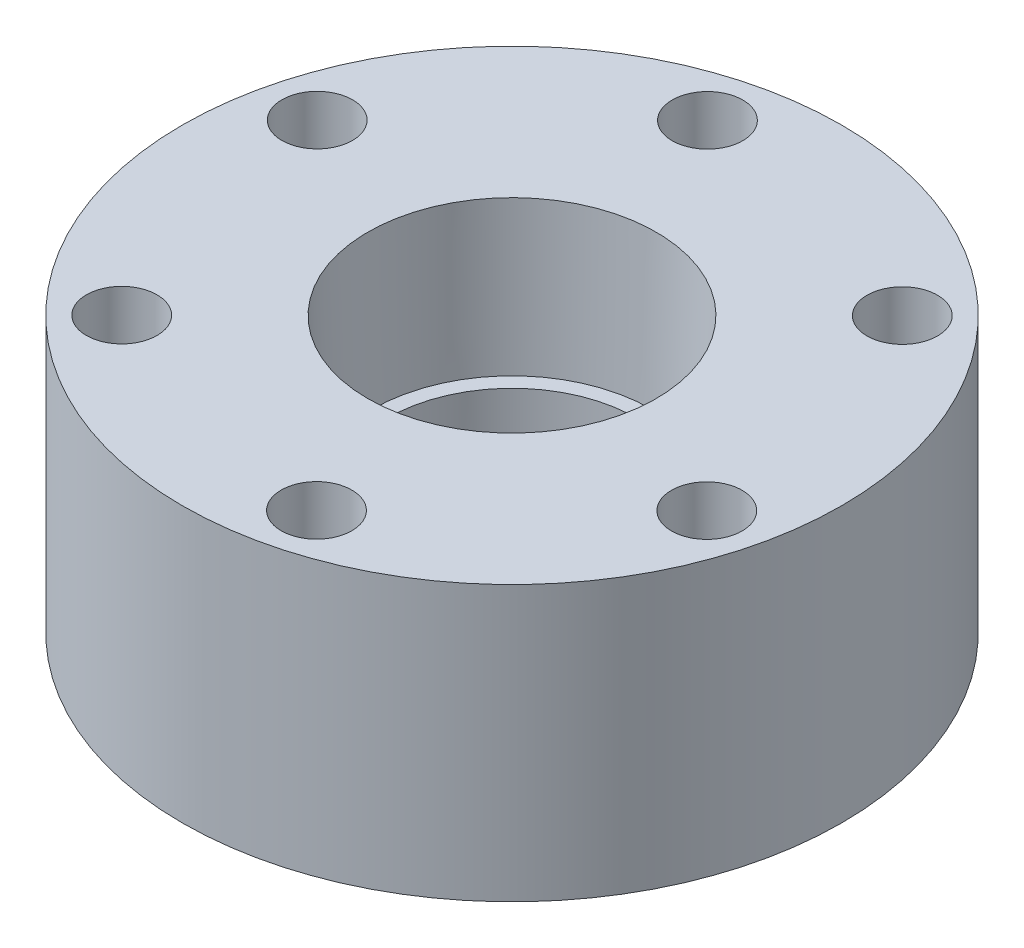
ISO-10303-21;
HEADER;
FILE_DESCRIPTION(('STEP AP214'),'2;1');
FILE_NAME('part.step','',(''),(''),'','','');
FILE_SCHEMA(('AUTOMOTIVE_DESIGN { 1 0 10303 214 1 1 1 1 }'));
ENDSEC;
DATA;
#1=APPLICATION_CONTEXT('core data for automotive mechanical design processes');
#2=APPLICATION_PROTOCOL_DEFINITION('international standard','automotive_design',2000,#1);
#3=PRODUCT_CONTEXT('',#1,'mechanical');
#4=PRODUCT('Part','Part','',(#3));
#5=PRODUCT_RELATED_PRODUCT_CATEGORY('part','',(#4));
#6=PRODUCT_DEFINITION_FORMATION('','',#4);
#7=PRODUCT_DEFINITION_CONTEXT('part definition',#1,'design');
#8=PRODUCT_DEFINITION('design','',#6,#7);
#9=PRODUCT_DEFINITION_SHAPE('','',#8);
#10=(LENGTH_UNIT() NAMED_UNIT(*) SI_UNIT(.MILLI.,.METRE.));
#11=(NAMED_UNIT(*) PLANE_ANGLE_UNIT() SI_UNIT($,.RADIAN.));
#12=(NAMED_UNIT(*) SI_UNIT($,.STERADIAN.) SOLID_ANGLE_UNIT());
#13=UNCERTAINTY_MEASURE_WITH_UNIT(LENGTH_MEASURE(1.E-05),#10,'distance_accuracy_value','');
#14=(GEOMETRIC_REPRESENTATION_CONTEXT(3) GLOBAL_UNCERTAINTY_ASSIGNED_CONTEXT((#13)) GLOBAL_UNIT_ASSIGNED_CONTEXT((#10,
#11,#12)) REPRESENTATION_CONTEXT('',''));
#15=CARTESIAN_POINT('',(0.,0.,0.));
#16=DIRECTION('',(0.,0.,1.));
#17=DIRECTION('',(1.,0.,0.));
#18=AXIS2_PLACEMENT_3D('',#15,#16,#17);
#19=CARTESIAN_POINT('',(0.,25.4,0.));
#20=DIRECTION('',(0.,-1.,0.));
#21=DIRECTION('',(0.,0.,-1.));
#22=AXIS2_PLACEMENT_3D('',#19,#20,#21);
#23=CYLINDRICAL_SURFACE('',#22,30.48);
#24=CARTESIAN_POINT('',(0.,25.4,0.));
#25=DIRECTION('',(0.,1.,0.));
#26=DIRECTION('',(0.,0.,1.));
#27=AXIS2_PLACEMENT_3D('',#24,#25,#26);
#28=CIRCLE('',#27,30.48);
#29=CARTESIAN_POINT('',(0.,25.4,30.48));
#30=VERTEX_POINT('',#29);
#31=EDGE_CURVE('E10',#30,#30,#28,.T.);
#32=ORIENTED_EDGE('',*,*,#31,.F.);
#33=EDGE_LOOP('',(#32));
#34=FACE_BOUND('',#33,.T.);
#35=CARTESIAN_POINT('',(0.,0.,0.));
#36=DIRECTION('',(0.,1.,0.));
#37=DIRECTION('',(0.,0.,1.));
#38=AXIS2_PLACEMENT_3D('',#35,#36,#37);
#39=CIRCLE('',#38,30.48);
#40=CARTESIAN_POINT('',(0.,0.,30.48));
#41=VERTEX_POINT('',#40);
#42=EDGE_CURVE('E38',#41,#41,#39,.T.);
#43=ORIENTED_EDGE('',*,*,#42,.T.);
#44=EDGE_LOOP('',(#43));
#45=FACE_BOUND('',#44,.T.);
#46=ADVANCED_FACE('F31',(#34,#45),#23,.T.);
#47=CARTESIAN_POINT('',(0.,25.4,0.));
#48=DIRECTION('',(0.,1.,0.));
#49=DIRECTION('',(0.,0.,1.));
#50=AXIS2_PLACEMENT_3D('',#47,#48,#49);
#51=PLANE('',#50);
#52=CARTESIAN_POINT('',(-24.6365333313498,25.4,-6.62788666644747));
#53=DIRECTION('',(0.,1.,0.));
#54=DIRECTION('',(0.,0.,1.));
#55=AXIS2_PLACEMENT_3D('',#52,#53,#54);
#56=CIRCLE('',#55,3.26389999999999);
#57=CARTESIAN_POINT('',(-24.6365333313498,25.4,-3.36398666644748));
#58=VERTEX_POINT('',#57);
#59=EDGE_CURVE('E92',#58,#58,#56,.T.);
#60=ORIENTED_EDGE('',*,*,#59,.F.);
#61=EDGE_LOOP('',(#60));
#62=FACE_BOUND('',#61,.T.);
#63=CARTESIAN_POINT('',(-18.0581848922215,25.4,18.0219203929074));
#64=DIRECTION('',(0.,1.,0.));
#65=DIRECTION('',(0.,0.,1.));
#66=AXIS2_PLACEMENT_3D('',#63,#64,#65);
#67=CIRCLE('',#66,3.26389999999999);
#68=CARTESIAN_POINT('',(-18.0581848922215,25.4,21.2858203929074));
#69=VERTEX_POINT('',#68);
#70=EDGE_CURVE('E86',#69,#69,#67,.T.);
#71=ORIENTED_EDGE('',*,*,#70,.F.);
#72=EDGE_LOOP('',(#71));
#73=FACE_BOUND('',#72,.T.);
#74=CARTESIAN_POINT('',(6.5783484391286,25.4,24.649807059354));
#75=DIRECTION('',(0.,1.,0.));
#76=DIRECTION('',(0.,0.,1.));
#77=AXIS2_PLACEMENT_3D('',#74,#75,#76);
#78=CIRCLE('',#77,3.26389999999999);
#79=CARTESIAN_POINT('',(6.5783484391286,25.4,27.913707059354));
#80=VERTEX_POINT('',#79);
#81=EDGE_CURVE('E80',#80,#80,#78,.T.);
#82=ORIENTED_EDGE('',*,*,#81,.F.);
#83=EDGE_LOOP('',(#82));
#84=FACE_BOUND('',#83,.T.);
#85=CARTESIAN_POINT('',(24.6365333313509,25.4,6.62788666644592));
#86=DIRECTION('',(0.,1.,0.));
#87=DIRECTION('',(0.,0.,1.));
#88=AXIS2_PLACEMENT_3D('',#85,#86,#87);
#89=CIRCLE('',#88,3.26389999999999);
#90=CARTESIAN_POINT('',(24.6365333313509,25.4,9.89178666644591));
#91=VERTEX_POINT('',#90);
#92=EDGE_CURVE('E74',#91,#91,#89,.T.);
#93=ORIENTED_EDGE('',*,*,#92,.F.);
#94=EDGE_LOOP('',(#93));
#95=FACE_BOUND('',#94,.T.);
#96=CARTESIAN_POINT('',(18.0581848922226,25.4,-18.0219203929091));
#97=DIRECTION('',(0.,1.,0.));
#98=DIRECTION('',(0.,0.,1.));
#99=AXIS2_PLACEMENT_3D('',#96,#97,#98);
#100=CIRCLE('',#99,3.26389999999999);
#101=CARTESIAN_POINT('',(18.0581848922226,25.4,-14.7580203929091));
#102=VERTEX_POINT('',#101);
#103=EDGE_CURVE('E68',#102,#102,#100,.T.);
#104=ORIENTED_EDGE('',*,*,#103,.F.);
#105=EDGE_LOOP('',(#104));
#106=FACE_BOUND('',#105,.T.);
#107=CARTESIAN_POINT('',(-6.57834843912766,25.4,-24.6498070593557));
#108=DIRECTION('',(0.,1.,0.));
#109=DIRECTION('',(0.,0.,1.));
#110=AXIS2_PLACEMENT_3D('',#107,#108,#109);
#111=CIRCLE('',#110,3.26389999999999);
#112=CARTESIAN_POINT('',(-6.57834843912766,25.4,-21.3859070593557));
#113=VERTEX_POINT('',#112);
#114=EDGE_CURVE('E62',#113,#113,#111,.T.);
#115=ORIENTED_EDGE('',*,*,#114,.F.);
#116=EDGE_LOOP('',(#115));
#117=FACE_BOUND('',#116,.T.);
#118=CARTESIAN_POINT('',(0.,25.4,0.));
#119=DIRECTION('',(0.,1.,0.));
#120=DIRECTION('',(0.,0.,1.));
#121=AXIS2_PLACEMENT_3D('',#118,#119,#120);
#122=CIRCLE('',#121,13.3324854);
#123=CARTESIAN_POINT('',(0.,25.4,13.3324854));
#124=VERTEX_POINT('',#123);
#125=EDGE_CURVE('E56',#124,#124,#122,.T.);
#126=ORIENTED_EDGE('',*,*,#125,.F.);
#127=EDGE_LOOP('',(#126));
#128=FACE_BOUND('',#127,.T.);
#129=ORIENTED_EDGE('',*,*,#31,.T.);
#130=EDGE_LOOP('',(#129));
#131=FACE_BOUND('',#130,.T.);
#132=ADVANCED_FACE('F98',(#62,#73,#84,#95,#106,#117,#128,#131),#51,.T.);
#133=CARTESIAN_POINT('',(0.,0.,0.));
#134=DIRECTION('',(0.,1.,0.));
#135=DIRECTION('',(0.,0.,1.));
#136=AXIS2_PLACEMENT_3D('',#133,#134,#135);
#137=PLANE('',#136);
#138=CARTESIAN_POINT('',(-24.6365333313498,0.,-6.62788666644747));
#139=DIRECTION('',(0.,1.,0.));
#140=DIRECTION('',(0.,0.,1.));
#141=AXIS2_PLACEMENT_3D('',#138,#139,#140);
#142=CIRCLE('',#141,3.2639);
#143=CARTESIAN_POINT('',(-24.6365333313498,0.,-3.36398666644747));
#144=VERTEX_POINT('',#143);
#145=EDGE_CURVE('E89',#144,#144,#142,.T.);
#146=ORIENTED_EDGE('',*,*,#145,.T.);
#147=EDGE_LOOP('',(#146));
#148=FACE_BOUND('',#147,.T.);
#149=CARTESIAN_POINT('',(-18.0581848922215,0.,18.0219203929074));
#150=DIRECTION('',(0.,1.,0.));
#151=DIRECTION('',(0.,0.,1.));
#152=AXIS2_PLACEMENT_3D('',#149,#150,#151);
#153=CIRCLE('',#152,3.2639);
#154=CARTESIAN_POINT('',(-18.0581848922215,0.,21.2858203929074));
#155=VERTEX_POINT('',#154);
#156=EDGE_CURVE('E83',#155,#155,#153,.T.);
#157=ORIENTED_EDGE('',*,*,#156,.T.);
#158=EDGE_LOOP('',(#157));
#159=FACE_BOUND('',#158,.T.);
#160=CARTESIAN_POINT('',(6.5783484391286,0.,24.649807059354));
#161=DIRECTION('',(0.,1.,0.));
#162=DIRECTION('',(0.,0.,1.));
#163=AXIS2_PLACEMENT_3D('',#160,#161,#162);
#164=CIRCLE('',#163,3.2639);
#165=CARTESIAN_POINT('',(6.5783484391286,0.,27.913707059354));
#166=VERTEX_POINT('',#165);
#167=EDGE_CURVE('E77',#166,#166,#164,.T.);
#168=ORIENTED_EDGE('',*,*,#167,.T.);
#169=EDGE_LOOP('',(#168));
#170=FACE_BOUND('',#169,.T.);
#171=CARTESIAN_POINT('',(24.6365333313509,0.,6.62788666644592));
#172=DIRECTION('',(0.,1.,0.));
#173=DIRECTION('',(0.,0.,1.));
#174=AXIS2_PLACEMENT_3D('',#171,#172,#173);
#175=CIRCLE('',#174,3.2639);
#176=CARTESIAN_POINT('',(24.6365333313509,0.,9.89178666644592));
#177=VERTEX_POINT('',#176);
#178=EDGE_CURVE('E71',#177,#177,#175,.T.);
#179=ORIENTED_EDGE('',*,*,#178,.T.);
#180=EDGE_LOOP('',(#179));
#181=FACE_BOUND('',#180,.T.);
#182=CARTESIAN_POINT('',(18.0581848922226,0.,-18.0219203929091));
#183=DIRECTION('',(0.,1.,0.));
#184=DIRECTION('',(0.,0.,1.));
#185=AXIS2_PLACEMENT_3D('',#182,#183,#184);
#186=CIRCLE('',#185,3.2639);
#187=CARTESIAN_POINT('',(18.0581848922226,0.,-14.7580203929091));
#188=VERTEX_POINT('',#187);
#189=EDGE_CURVE('E65',#188,#188,#186,.T.);
#190=ORIENTED_EDGE('',*,*,#189,.T.);
#191=EDGE_LOOP('',(#190));
#192=FACE_BOUND('',#191,.T.);
#193=CARTESIAN_POINT('',(-6.57834843912766,0.,-24.6498070593557));
#194=DIRECTION('',(0.,1.,0.));
#195=DIRECTION('',(0.,0.,1.));
#196=AXIS2_PLACEMENT_3D('',#193,#194,#195);
#197=CIRCLE('',#196,3.2639);
#198=CARTESIAN_POINT('',(-6.57834843912766,0.,-21.3859070593557));
#199=VERTEX_POINT('',#198);
#200=EDGE_CURVE('E59',#199,#199,#197,.T.);
#201=ORIENTED_EDGE('',*,*,#200,.T.);
#202=EDGE_LOOP('',(#201));
#203=FACE_BOUND('',#202,.T.);
#204=CARTESIAN_POINT('',(0.,0.,0.));
#205=DIRECTION('',(0.,-1.,0.));
#206=DIRECTION('',(0.,0.,-1.));
#207=AXIS2_PLACEMENT_3D('',#204,#205,#206);
#208=CIRCLE('',#207,20.6502);
#209=CARTESIAN_POINT('',(0.,0.,-20.6502));
#210=VERTEX_POINT('',#209);
#211=EDGE_CURVE('E45',#210,#210,#208,.T.);
#212=ORIENTED_EDGE('',*,*,#211,.F.);
#213=EDGE_LOOP('',(#212));
#214=FACE_BOUND('',#213,.T.);
#215=ORIENTED_EDGE('',*,*,#42,.F.);
#216=EDGE_LOOP('',(#215));
#217=FACE_BOUND('',#216,.T.);
#218=ADVANCED_FACE('F101',(#148,#159,#170,#181,#192,#203,#214,#217),#137,.F.);
#219=CARTESIAN_POINT('',(0.,6.35,0.));
#220=DIRECTION('',(0.,-1.,0.));
#221=DIRECTION('',(0.,0.,-1.));
#222=AXIS2_PLACEMENT_3D('',#219,#220,#221);
#223=CYLINDRICAL_SURFACE('',#222,20.6502);
#224=CARTESIAN_POINT('',(0.,6.35,0.));
#225=DIRECTION('',(0.,-1.,0.));
#226=DIRECTION('',(0.,0.,-1.));
#227=AXIS2_PLACEMENT_3D('',#224,#225,#226);
#228=CIRCLE('',#227,20.6502);
#229=CARTESIAN_POINT('',(0.,6.35,-20.6502));
#230=VERTEX_POINT('',#229);
#231=EDGE_CURVE('E43',#230,#230,#228,.T.);
#232=ORIENTED_EDGE('',*,*,#231,.F.);
#233=EDGE_LOOP('',(#232));
#234=FACE_BOUND('',#233,.T.);
#235=ORIENTED_EDGE('',*,*,#211,.T.);
#236=EDGE_LOOP('',(#235));
#237=FACE_BOUND('',#236,.T.);
#238=ADVANCED_FACE('F141',(#234,#237),#223,.F.);
#239=CARTESIAN_POINT('',(0.,6.35,0.));
#240=DIRECTION('',(0.,-1.,0.));
#241=DIRECTION('',(0.,0.,-1.));
#242=AXIS2_PLACEMENT_3D('',#239,#240,#241);
#243=PLANE('',#242);
#244=CARTESIAN_POINT('',(0.,6.35,0.));
#245=DIRECTION('',(0.,-1.,0.));
#246=DIRECTION('',(0.,0.,-1.));
#247=AXIS2_PLACEMENT_3D('',#244,#245,#246);
#248=CIRCLE('',#247,11.5062);
#249=CARTESIAN_POINT('',(0.,6.35,-11.5062));
#250=VERTEX_POINT('',#249);
#251=EDGE_CURVE('E34',#250,#250,#248,.T.);
#252=ORIENTED_EDGE('',*,*,#251,.F.);
#253=EDGE_LOOP('',(#252));
#254=FACE_BOUND('',#253,.T.);
#255=ORIENTED_EDGE('',*,*,#231,.T.);
#256=EDGE_LOOP('',(#255));
#257=FACE_BOUND('',#256,.T.);
#258=ADVANCED_FACE('F147',(#254,#257),#243,.T.);
#259=CARTESIAN_POINT('',(0.,25.4,0.));
#260=DIRECTION('',(0.,1.,0.));
#261=DIRECTION('',(0.,0.,1.));
#262=AXIS2_PLACEMENT_3D('',#259,#260,#261);
#263=CYLINDRICAL_SURFACE('',#262,11.5062);
#264=ORIENTED_EDGE('',*,*,#251,.T.);
#265=EDGE_LOOP('',(#264));
#266=FACE_BOUND('',#265,.T.);
#267=CARTESIAN_POINT('',(0.,11.43,0.));
#268=DIRECTION('',(0.,1.,0.));
#269=DIRECTION('',(0.,0.,1.));
#270=AXIS2_PLACEMENT_3D('',#267,#268,#269);
#271=CIRCLE('',#270,11.5062);
#272=CARTESIAN_POINT('',(0.,11.43,11.5062));
#273=VERTEX_POINT('',#272);
#274=EDGE_CURVE('E50',#273,#273,#271,.T.);
#275=ORIENTED_EDGE('',*,*,#274,.T.);
#276=EDGE_LOOP('',(#275));
#277=FACE_BOUND('',#276,.T.);
#278=ADVANCED_FACE('F128',(#266,#277),#263,.F.);
#279=CARTESIAN_POINT('',(11.5062,11.43,0.));
#280=DIRECTION('',(0.,-1.,0.));
#281=DIRECTION('',(0.,0.,-1.));
#282=AXIS2_PLACEMENT_3D('',#279,#280,#281);
#283=PLANE('',#282);
#284=ORIENTED_EDGE('',*,*,#274,.F.);
#285=EDGE_LOOP('',(#284));
#286=FACE_BOUND('',#285,.T.);
#287=CARTESIAN_POINT('',(0.,11.43,0.));
#288=DIRECTION('',(0.,1.,0.));
#289=DIRECTION('',(0.,0.,1.));
#290=AXIS2_PLACEMENT_3D('',#287,#288,#289);
#291=CIRCLE('',#290,12.9142048917877);
#292=CARTESIAN_POINT('',(0.,11.43,12.9142048917877));
#293=VERTEX_POINT('',#292);
#294=EDGE_CURVE('E53',#293,#293,#291,.T.);
#295=ORIENTED_EDGE('',*,*,#294,.T.);
#296=EDGE_LOOP('',(#295));
#297=FACE_BOUND('',#296,.T.);
#298=ADVANCED_FACE('F118',(#286,#297),#283,.F.);
#299=CARTESIAN_POINT('',(0.,25.4,0.));
#300=DIRECTION('',(0.,1.,0.));
#301=DIRECTION('',(0.,0.,1.));
#302=AXIS2_PLACEMENT_3D('',#299,#300,#301);
#303=CONICAL_SURFACE('',#302,13.3324854,0.0299323966717026);
#304=ORIENTED_EDGE('',*,*,#294,.F.);
#305=EDGE_LOOP('',(#304));
#306=FACE_BOUND('',#305,.T.);
#307=ORIENTED_EDGE('',*,*,#125,.T.);
#308=EDGE_LOOP('',(#307));
#309=FACE_BOUND('',#308,.T.);
#310=ADVANCED_FACE('F115',(#306,#309),#303,.F.);
#311=CARTESIAN_POINT('',(-6.57834843912766,25.4,-24.6498070593557));
#312=DIRECTION('',(0.,1.,0.));
#313=DIRECTION('',(0.,0.,1.));
#314=AXIS2_PLACEMENT_3D('',#311,#312,#313);
#315=CYLINDRICAL_SURFACE('',#314,3.26389999999999);
#316=ORIENTED_EDGE('',*,*,#200,.F.);
#317=EDGE_LOOP('',(#316));
#318=FACE_BOUND('',#317,.T.);
#319=ORIENTED_EDGE('',*,*,#114,.T.);
#320=EDGE_LOOP('',(#319));
#321=FACE_BOUND('',#320,.T.);
#322=ADVANCED_FACE('F117',(#318,#321),#315,.F.);
#323=CARTESIAN_POINT('',(18.0581848922226,25.4,-18.0219203929091));
#324=DIRECTION('',(0.,1.,0.));
#325=DIRECTION('',(0.,0.,1.));
#326=AXIS2_PLACEMENT_3D('',#323,#324,#325);
#327=CYLINDRICAL_SURFACE('',#326,3.26389999999999);
#328=ORIENTED_EDGE('',*,*,#189,.F.);
#329=EDGE_LOOP('',(#328));
#330=FACE_BOUND('',#329,.T.);
#331=ORIENTED_EDGE('',*,*,#103,.T.);
#332=EDGE_LOOP('',(#331));
#333=FACE_BOUND('',#332,.T.);
#334=ADVANCED_FACE('F125',(#330,#333),#327,.F.);
#335=CARTESIAN_POINT('',(24.6365333313509,25.4,6.62788666644592));
#336=DIRECTION('',(0.,1.,0.));
#337=DIRECTION('',(0.,0.,1.));
#338=AXIS2_PLACEMENT_3D('',#335,#336,#337);
#339=CYLINDRICAL_SURFACE('',#338,3.26389999999999);
#340=ORIENTED_EDGE('',*,*,#178,.F.);
#341=EDGE_LOOP('',(#340));
#342=FACE_BOUND('',#341,.T.);
#343=ORIENTED_EDGE('',*,*,#92,.T.);
#344=EDGE_LOOP('',(#343));
#345=FACE_BOUND('',#344,.T.);
#346=ADVANCED_FACE('F218',(#342,#345),#339,.F.);
#347=CARTESIAN_POINT('',(6.5783484391286,25.4,24.649807059354));
#348=DIRECTION('',(0.,1.,0.));
#349=DIRECTION('',(0.,0.,1.));
#350=AXIS2_PLACEMENT_3D('',#347,#348,#349);
#351=CYLINDRICAL_SURFACE('',#350,3.26389999999999);
#352=ORIENTED_EDGE('',*,*,#167,.F.);
#353=EDGE_LOOP('',(#352));
#354=FACE_BOUND('',#353,.T.);
#355=ORIENTED_EDGE('',*,*,#81,.T.);
#356=EDGE_LOOP('',(#355));
#357=FACE_BOUND('',#356,.T.);
#358=ADVANCED_FACE('F227',(#354,#357),#351,.F.);
#359=CARTESIAN_POINT('',(-18.0581848922215,25.4,18.0219203929074));
#360=DIRECTION('',(0.,1.,0.));
#361=DIRECTION('',(0.,0.,1.));
#362=AXIS2_PLACEMENT_3D('',#359,#360,#361);
#363=CYLINDRICAL_SURFACE('',#362,3.26389999999999);
#364=ORIENTED_EDGE('',*,*,#156,.F.);
#365=EDGE_LOOP('',(#364));
#366=FACE_BOUND('',#365,.T.);
#367=ORIENTED_EDGE('',*,*,#70,.T.);
#368=EDGE_LOOP('',(#367));
#369=FACE_BOUND('',#368,.T.);
#370=ADVANCED_FACE('F236',(#366,#369),#363,.F.);
#371=CARTESIAN_POINT('',(-24.6365333313498,25.4,-6.62788666644747));
#372=DIRECTION('',(0.,1.,0.));
#373=DIRECTION('',(0.,0.,1.));
#374=AXIS2_PLACEMENT_3D('',#371,#372,#373);
#375=CYLINDRICAL_SURFACE('',#374,3.26389999999999);
#376=ORIENTED_EDGE('',*,*,#145,.F.);
#377=EDGE_LOOP('',(#376));
#378=FACE_BOUND('',#377,.T.);
#379=ORIENTED_EDGE('',*,*,#59,.T.);
#380=EDGE_LOOP('',(#379));
#381=FACE_BOUND('',#380,.T.);
#382=ADVANCED_FACE('F96',(#378,#381),#375,.F.);
#383=CLOSED_SHELL('',(#46,#132,#218,#238,#258,#278,#298,#310,#322,#334,#346,#358,#370,#382));
#384=MANIFOLD_SOLID_BREP('B2',#383);
#385=ADVANCED_BREP_SHAPE_REPRESENTATION('',(#18,#384),#14);
#386=SHAPE_DEFINITION_REPRESENTATION(#9,#385);
ENDSEC;
END-ISO-10303-21;
